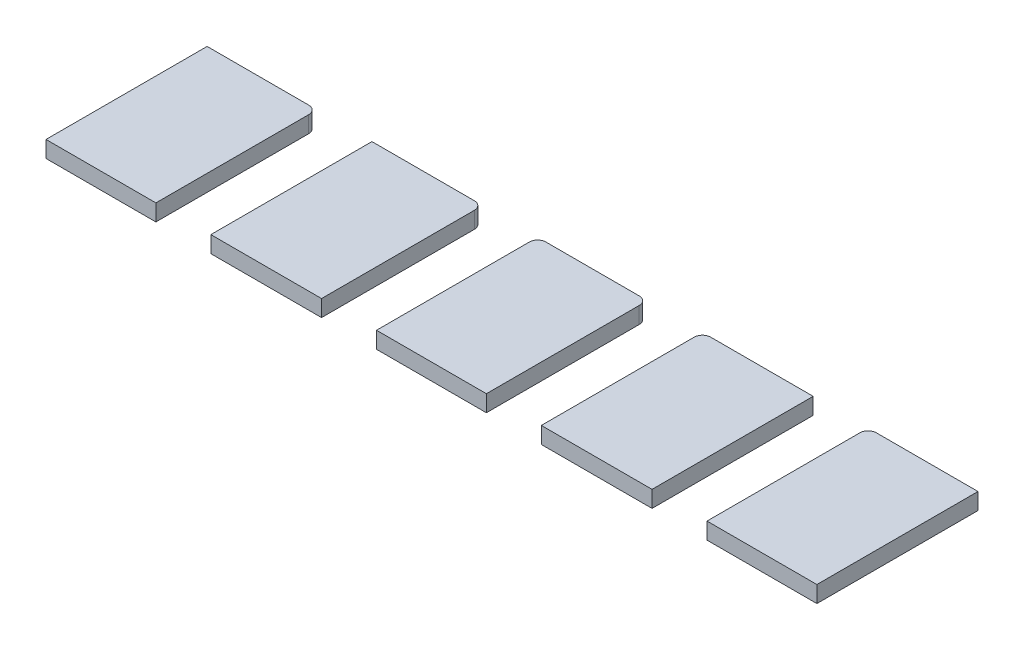
ISO-10303-21;
HEADER;
FILE_DESCRIPTION(('STEP AP214'),'2;1');
FILE_NAME('part.step','',(''),(''),'','','');
FILE_SCHEMA(('AUTOMOTIVE_DESIGN { 1 0 10303 214 1 1 1 1 }'));
ENDSEC;
DATA;
#1=APPLICATION_CONTEXT('core data for automotive mechanical design processes');
#2=APPLICATION_PROTOCOL_DEFINITION('international standard','automotive_design',2000,#1);
#3=PRODUCT_CONTEXT('',#1,'mechanical');
#4=PRODUCT('Part','Part','',(#3));
#5=PRODUCT_RELATED_PRODUCT_CATEGORY('part','',(#4));
#6=PRODUCT_DEFINITION_FORMATION('','',#4);
#7=PRODUCT_DEFINITION_CONTEXT('part definition',#1,'design');
#8=PRODUCT_DEFINITION('design','',#6,#7);
#9=PRODUCT_DEFINITION_SHAPE('','',#8);
#10=(LENGTH_UNIT() NAMED_UNIT(*) SI_UNIT(.MILLI.,.METRE.));
#11=(NAMED_UNIT(*) PLANE_ANGLE_UNIT() SI_UNIT($,.RADIAN.));
#12=(NAMED_UNIT(*) SI_UNIT($,.STERADIAN.) SOLID_ANGLE_UNIT());
#13=UNCERTAINTY_MEASURE_WITH_UNIT(LENGTH_MEASURE(1.E-05),#10,'distance_accuracy_value','');
#14=(GEOMETRIC_REPRESENTATION_CONTEXT(3) GLOBAL_UNCERTAINTY_ASSIGNED_CONTEXT((#13)) GLOBAL_UNIT_ASSIGNED_CONTEXT((#10,
#11,#12)) REPRESENTATION_CONTEXT('',''));
#15=CARTESIAN_POINT('',(0.,0.,0.));
#16=DIRECTION('',(0.,0.,1.));
#17=DIRECTION('',(1.,0.,0.));
#18=AXIS2_PLACEMENT_3D('',#15,#16,#17);
#19=CARTESIAN_POINT('',(-1.3784,12.88,7.861));
#20=DIRECTION('',(0.,-1.,0.));
#21=DIRECTION('',(0.,0.,1.));
#22=AXIS2_PLACEMENT_3D('',#19,#20,#21);
#23=PLANE('',#22);
#24=CARTESIAN_POINT('',(-2.795,12.8800000000029,8.));
#25=DIRECTION('',(0.,1.,0.));
#26=DIRECTION('',(0.,0.,1.));
#27=AXIS2_PLACEMENT_3D('',#24,#25,#26);
#28=CIRCLE('',#27,0.0999999999999994);
#29=CARTESIAN_POINT('',(-2.895,12.8800000000029,8.00000000000001));
#30=VERTEX_POINT('',#29);
#31=CARTESIAN_POINT('',(-2.79500000000009,12.8800000000014,7.9));
#32=VERTEX_POINT('',#31);
#33=EDGE_CURVE('P0_E20',#30,#32,#28,.F.);
#34=ORIENTED_EDGE('',*,*,#33,.T.);
#35=DIRECTION('',(-1.,0.,0.));
#36=VECTOR('',#35,1.);
#37=CARTESIAN_POINT('',(-1.9475,12.8800000000028,7.9));
#38=LINE('',#37,#36);
#39=CARTESIAN_POINT('',(-1.56499999999994,12.8800000000028,7.89999999999989));
#40=VERTEX_POINT('',#39);
#41=EDGE_CURVE('P0_E73',#40,#32,#38,.T.);
#42=ORIENTED_EDGE('',*,*,#41,.F.);
#43=DIRECTION('',(0.,0.,1.));
#44=VECTOR('',#43,1.);
#45=CARTESIAN_POINT('',(-1.565,12.8800000000028,9.01));
#46=LINE('',#45,#44);
#47=CARTESIAN_POINT('',(-1.565,12.8800000000028,9.85));
#48=VERTEX_POINT('',#47);
#49=EDGE_CURVE('P0_E68',#40,#48,#46,.T.);
#50=ORIENTED_EDGE('',*,*,#49,.T.);
#51=DIRECTION('',(-1.,0.,0.));
#52=VECTOR('',#51,1.);
#53=CARTESIAN_POINT('',(-6.23,12.8800000000028,9.85));
#54=LINE('',#53,#52);
#55=CARTESIAN_POINT('',(-2.895,12.8800000000028,9.85));
#56=VERTEX_POINT('',#55);
#57=EDGE_CURVE('P0_E102',#48,#56,#54,.T.);
#58=ORIENTED_EDGE('',*,*,#57,.T.);
#59=DIRECTION('',(0.,0.,1.));
#60=VECTOR('',#59,1.);
#61=CARTESIAN_POINT('',(-2.895,12.8800000000028,8.925));
#62=LINE('',#61,#60);
#63=EDGE_CURVE('P0_E57',#30,#56,#62,.T.);
#64=ORIENTED_EDGE('',*,*,#63,.F.);
#65=EDGE_LOOP('',(#34,#42,#50,#58,#64));
#66=FACE_BOUND('',#65,.T.);
#67=ADVANCED_FACE('P0_F16',(#66),#23,.T.);
#68=CARTESIAN_POINT('',(-1.565,12.84637000268,8.136370002676));
#69=DIRECTION('',(-1.,0.,0.));
#70=DIRECTION('',(0.,0.,1.));
#71=AXIS2_PLACEMENT_3D('',#68,#69,#70);
#72=PLANE('',#71);
#73=DIRECTION('',(0.,-1.,0.));
#74=VECTOR('',#73,1.);
#75=CARTESIAN_POINT('',(-1.565,12.98,9.85));
#76=LINE('',#75,#74);
#77=CARTESIAN_POINT('',(-1.565,13.08,9.85));
#78=VERTEX_POINT('',#77);
#79=EDGE_CURVE('P0_E100',#78,#48,#76,.T.);
#80=ORIENTED_EDGE('',*,*,#79,.T.);
#81=ORIENTED_EDGE('',*,*,#49,.F.);
#82=DIRECTION('',(0.,-1.,0.));
#83=VECTOR('',#82,1.);
#84=CARTESIAN_POINT('',(-1.565,12.98,7.89999999999984));
#85=LINE('',#84,#83);
#86=CARTESIAN_POINT('',(-1.565,13.08,7.89999999999995));
#87=VERTEX_POINT('',#86);
#88=EDGE_CURVE('P0_E76',#87,#40,#85,.T.);
#89=ORIENTED_EDGE('',*,*,#88,.F.);
#90=DIRECTION('',(0.,0.,1.));
#91=VECTOR('',#90,1.);
#92=CARTESIAN_POINT('',(-1.565,13.08,8.875));
#93=LINE('',#92,#91);
#94=EDGE_CURVE('P0_E82',#87,#78,#93,.T.);
#95=ORIENTED_EDGE('',*,*,#94,.T.);
#96=EDGE_LOOP('',(#80,#81,#89,#95));
#97=FACE_BOUND('',#96,.T.);
#98=ADVANCED_FACE('P0_F127',(#97),#72,.F.);
#99=CARTESIAN_POINT('',(-11.0816,13.11362999732,9.85));
#100=DIRECTION('',(0.,0.,-1.));
#101=DIRECTION('',(1.,0.,0.));
#102=AXIS2_PLACEMENT_3D('',#99,#100,#101);
#103=PLANE('',#102);
#104=DIRECTION('',(0.,1.,0.));
#105=VECTOR('',#104,1.);
#106=CARTESIAN_POINT('',(-2.895,12.98,9.85));
#107=LINE('',#106,#105);
#108=CARTESIAN_POINT('',(-2.895,13.08,9.85));
#109=VERTEX_POINT('',#108);
#110=EDGE_CURVE('P0_E84',#56,#109,#107,.T.);
#111=ORIENTED_EDGE('',*,*,#110,.F.);
#112=ORIENTED_EDGE('',*,*,#57,.F.);
#113=ORIENTED_EDGE('',*,*,#79,.F.);
#114=DIRECTION('',(-1.,0.,0.));
#115=VECTOR('',#114,1.);
#116=CARTESIAN_POINT('',(-6.23,13.08,9.85));
#117=LINE('',#116,#115);
#118=EDGE_CURVE('P0_E95',#78,#109,#117,.T.);
#119=ORIENTED_EDGE('',*,*,#118,.T.);
#120=EDGE_LOOP('',(#111,#112,#113,#119));
#121=FACE_BOUND('',#120,.T.);
#122=ADVANCED_FACE('P0_F125',(#121),#103,.F.);
#123=CARTESIAN_POINT('',(-2.895,12.84637000268,7.963));
#124=DIRECTION('',(-1.,0.,0.));
#125=DIRECTION('',(0.,0.,1.));
#126=AXIS2_PLACEMENT_3D('',#123,#124,#125);
#127=PLANE('',#126);
#128=ORIENTED_EDGE('',*,*,#110,.T.);
#129=DIRECTION('',(0.,0.,-1.));
#130=VECTOR('',#129,1.);
#131=CARTESIAN_POINT('',(-2.895,13.08,8.875));
#132=LINE('',#131,#130);
#133=CARTESIAN_POINT('',(-2.895,13.0799999999986,8.00000000000001));
#134=VERTEX_POINT('',#133);
#135=EDGE_CURVE('P0_E26',#109,#134,#132,.T.);
#136=ORIENTED_EDGE('',*,*,#135,.T.);
#137=DIRECTION('',(0.,-1.,0.));
#138=VECTOR('',#137,1.);
#139=CARTESIAN_POINT('',(-2.895,12.98,8.00000000000001));
#140=LINE('',#139,#138);
#141=EDGE_CURVE('P0_E80',#134,#30,#140,.T.);
#142=ORIENTED_EDGE('',*,*,#141,.T.);
#143=ORIENTED_EDGE('',*,*,#63,.T.);
#144=EDGE_LOOP('',(#128,#136,#142,#143));
#145=FACE_BOUND('',#144,.T.);
#146=ADVANCED_FACE('P0_F130',(#145),#127,.T.);
#147=CARTESIAN_POINT('',(-2.795,12.8800000000029,8.));
#148=DIRECTION('',(0.,1.,0.));
#149=DIRECTION('',(0.,0.,1.));
#150=AXIS2_PLACEMENT_3D('',#147,#148,#149);
#151=CYLINDRICAL_SURFACE('',#150,0.0999999999999994);
#152=ORIENTED_EDGE('',*,*,#141,.F.);
#153=CARTESIAN_POINT('',(-2.795,13.0799999999971,8.));
#154=DIRECTION('',(0.,1.,0.));
#155=DIRECTION('',(0.,0.,1.));
#156=AXIS2_PLACEMENT_3D('',#153,#154,#155);
#157=CIRCLE('',#156,0.0999999999999994);
#158=CARTESIAN_POINT('',(-2.79500000000009,13.0799999999986,7.9));
#159=VERTEX_POINT('',#158);
#160=EDGE_CURVE('P0_E11',#134,#159,#157,.F.);
#161=ORIENTED_EDGE('',*,*,#160,.T.);
#162=DIRECTION('',(0.,1.,0.));
#163=VECTOR('',#162,1.);
#164=CARTESIAN_POINT('',(-2.79500000000017,12.98,7.9));
#165=LINE('',#164,#163);
#166=EDGE_CURVE('P0_E75',#32,#159,#165,.T.);
#167=ORIENTED_EDGE('',*,*,#166,.F.);
#168=ORIENTED_EDGE('',*,*,#33,.F.);
#169=EDGE_LOOP('',(#152,#161,#167,#168));
#170=FACE_BOUND('',#169,.T.);
#171=ADVANCED_FACE('P0_F79',(#170),#151,.T.);
#172=CARTESIAN_POINT('',(-2.296370002676,12.84637000268,7.9));
#173=DIRECTION('',(0.,0.,-1.));
#174=DIRECTION('',(-1.,0.,0.));
#175=AXIS2_PLACEMENT_3D('',#172,#173,#174);
#176=PLANE('',#175);
#177=ORIENTED_EDGE('',*,*,#41,.T.);
#178=ORIENTED_EDGE('',*,*,#166,.T.);
#179=DIRECTION('',(1.,0.,0.));
#180=VECTOR('',#179,1.);
#181=CARTESIAN_POINT('',(-6.23,13.08,7.9));
#182=LINE('',#181,#180);
#183=EDGE_CURVE('P0_E34',#159,#87,#182,.T.);
#184=ORIENTED_EDGE('',*,*,#183,.T.);
#185=ORIENTED_EDGE('',*,*,#88,.T.);
#186=EDGE_LOOP('',(#177,#178,#184,#185));
#187=FACE_BOUND('',#186,.T.);
#188=ADVANCED_FACE('P0_F74',(#187),#176,.T.);
#189=CARTESIAN_POINT('',(-1.3784,13.08,7.861));
#190=DIRECTION('',(0.,-1.,0.));
#191=DIRECTION('',(0.,0.,1.));
#192=AXIS2_PLACEMENT_3D('',#189,#190,#191);
#193=PLANE('',#192);
#194=ORIENTED_EDGE('',*,*,#160,.F.);
#195=ORIENTED_EDGE('',*,*,#135,.F.);
#196=ORIENTED_EDGE('',*,*,#118,.F.);
#197=ORIENTED_EDGE('',*,*,#94,.F.);
#198=ORIENTED_EDGE('',*,*,#183,.F.);
#199=EDGE_LOOP('',(#194,#195,#196,#197,#198));
#200=FACE_BOUND('',#199,.T.);
#201=ADVANCED_FACE('P0_F18',(#200),#193,.F.);
#202=CLOSED_SHELL('',(#67,#98,#122,#146,#171,#188,#201));
#203=MANIFOLD_SOLID_BREP('P0_B1',#202);
#204=CARTESIAN_POINT('',(-1.3784,12.88,7.861));
#205=DIRECTION('',(0.,-1.,0.));
#206=DIRECTION('',(0.,0.,1.));
#207=AXIS2_PLACEMENT_3D('',#204,#205,#206);
#208=PLANE('',#207);
#209=CARTESIAN_POINT('',(-4.8,12.8800000000029,8.));
#210=DIRECTION('',(0.,1.,0.));
#211=DIRECTION('',(0.,0.,1.));
#212=AXIS2_PLACEMENT_3D('',#209,#210,#211);
#213=CIRCLE('',#212,0.0999999999999994);
#214=CARTESIAN_POINT('',(-4.9,12.8800000000029,8.00000000000001));
#215=VERTEX_POINT('',#214);
#216=CARTESIAN_POINT('',(-4.80000000000009,12.8800000000014,7.9));
#217=VERTEX_POINT('',#216);
#218=EDGE_CURVE('P1_E20',#215,#217,#213,.F.);
#219=ORIENTED_EDGE('',*,*,#218,.T.);
#220=DIRECTION('',(-1.,0.,0.));
#221=VECTOR('',#220,1.);
#222=CARTESIAN_POINT('',(-3.945,12.8800000000028,7.9));
#223=LINE('',#222,#221);
#224=CARTESIAN_POINT('',(-3.55999999999994,12.8800000000028,7.9));
#225=VERTEX_POINT('',#224);
#226=EDGE_CURVE('P1_E68',#225,#217,#223,.T.);
#227=ORIENTED_EDGE('',*,*,#226,.F.);
#228=DIRECTION('',(0.,0.,1.));
#229=VECTOR('',#228,1.);
#230=CARTESIAN_POINT('',(-3.56,12.8800000000028,8.875));
#231=LINE('',#230,#229);
#232=CARTESIAN_POINT('',(-3.56,12.8800000000028,9.85));
#233=VERTEX_POINT('',#232);
#234=EDGE_CURVE('P1_E101',#225,#233,#231,.T.);
#235=ORIENTED_EDGE('',*,*,#234,.T.);
#236=DIRECTION('',(-1.,0.,0.));
#237=VECTOR('',#236,1.);
#238=CARTESIAN_POINT('',(-6.23,12.8800000000028,9.85));
#239=LINE('',#238,#237);
#240=CARTESIAN_POINT('',(-4.9,12.8800000000028,9.85));
#241=VERTEX_POINT('',#240);
#242=EDGE_CURVE('P1_E100',#233,#241,#239,.T.);
#243=ORIENTED_EDGE('',*,*,#242,.T.);
#244=DIRECTION('',(0.,0.,1.));
#245=VECTOR('',#244,1.);
#246=CARTESIAN_POINT('',(-4.9,12.8800000000028,8.925));
#247=LINE('',#246,#245);
#248=EDGE_CURVE('P1_E57',#215,#241,#247,.T.);
#249=ORIENTED_EDGE('',*,*,#248,.F.);
#250=EDGE_LOOP('',(#219,#227,#235,#243,#249));
#251=FACE_BOUND('',#250,.T.);
#252=ADVANCED_FACE('P1_F16',(#251),#208,.T.);
#253=CARTESIAN_POINT('',(-3.56,12.84637000268,7.861));
#254=DIRECTION('',(-1.,0.,0.));
#255=DIRECTION('',(0.,0.,1.));
#256=AXIS2_PLACEMENT_3D('',#253,#254,#255);
#257=PLANE('',#256);
#258=DIRECTION('',(0.,-1.,0.));
#259=VECTOR('',#258,1.);
#260=CARTESIAN_POINT('',(-3.56,12.98,9.85));
#261=LINE('',#260,#259);
#262=CARTESIAN_POINT('',(-3.56,13.08,9.85));
#263=VERTEX_POINT('',#262);
#264=EDGE_CURVE('P1_E97',#263,#233,#261,.T.);
#265=ORIENTED_EDGE('',*,*,#264,.T.);
#266=ORIENTED_EDGE('',*,*,#234,.F.);
#267=DIRECTION('',(0.,-1.,0.));
#268=VECTOR('',#267,1.);
#269=CARTESIAN_POINT('',(-3.56,12.98,7.9));
#270=LINE('',#269,#268);
#271=CARTESIAN_POINT('',(-3.56,13.08,7.9));
#272=VERTEX_POINT('',#271);
#273=EDGE_CURVE('P1_E74',#272,#225,#270,.T.);
#274=ORIENTED_EDGE('',*,*,#273,.F.);
#275=DIRECTION('',(0.,0.,1.));
#276=VECTOR('',#275,1.);
#277=CARTESIAN_POINT('',(-3.56,13.08,8.875));
#278=LINE('',#277,#276);
#279=EDGE_CURVE('P1_E79',#272,#263,#278,.T.);
#280=ORIENTED_EDGE('',*,*,#279,.T.);
#281=EDGE_LOOP('',(#265,#266,#274,#280));
#282=FACE_BOUND('',#281,.T.);
#283=ADVANCED_FACE('P1_F127',(#282),#257,.F.);
#284=CARTESIAN_POINT('',(-11.0816,13.11362999732,9.85));
#285=DIRECTION('',(0.,0.,-1.));
#286=DIRECTION('',(1.,0.,0.));
#287=AXIS2_PLACEMENT_3D('',#284,#285,#286);
#288=PLANE('',#287);
#289=DIRECTION('',(0.,1.,0.));
#290=VECTOR('',#289,1.);
#291=CARTESIAN_POINT('',(-4.9,12.98,9.85));
#292=LINE('',#291,#290);
#293=CARTESIAN_POINT('',(-4.9,13.08,9.85));
#294=VERTEX_POINT('',#293);
#295=EDGE_CURVE('P1_E81',#241,#294,#292,.T.);
#296=ORIENTED_EDGE('',*,*,#295,.F.);
#297=ORIENTED_EDGE('',*,*,#242,.F.);
#298=ORIENTED_EDGE('',*,*,#264,.F.);
#299=DIRECTION('',(-1.,0.,0.));
#300=VECTOR('',#299,1.);
#301=CARTESIAN_POINT('',(-6.23,13.08,9.85));
#302=LINE('',#301,#300);
#303=EDGE_CURVE('P1_E92',#263,#294,#302,.T.);
#304=ORIENTED_EDGE('',*,*,#303,.T.);
#305=EDGE_LOOP('',(#296,#297,#298,#304));
#306=FACE_BOUND('',#305,.T.);
#307=ADVANCED_FACE('P1_F125',(#306),#288,.F.);
#308=CARTESIAN_POINT('',(-4.9,12.84637000268,7.963));
#309=DIRECTION('',(-1.,0.,0.));
#310=DIRECTION('',(0.,0.,1.));
#311=AXIS2_PLACEMENT_3D('',#308,#309,#310);
#312=PLANE('',#311);
#313=ORIENTED_EDGE('',*,*,#295,.T.);
#314=DIRECTION('',(0.,0.,-1.));
#315=VECTOR('',#314,1.);
#316=CARTESIAN_POINT('',(-4.9,13.08,8.875));
#317=LINE('',#316,#315);
#318=CARTESIAN_POINT('',(-4.9,13.0799999999986,8.00000000000001));
#319=VERTEX_POINT('',#318);
#320=EDGE_CURVE('P1_E26',#294,#319,#317,.T.);
#321=ORIENTED_EDGE('',*,*,#320,.T.);
#322=DIRECTION('',(0.,-1.,0.));
#323=VECTOR('',#322,1.);
#324=CARTESIAN_POINT('',(-4.9,12.98,8.00000000000001));
#325=LINE('',#324,#323);
#326=EDGE_CURVE('P1_E77',#319,#215,#325,.T.);
#327=ORIENTED_EDGE('',*,*,#326,.T.);
#328=ORIENTED_EDGE('',*,*,#248,.T.);
#329=EDGE_LOOP('',(#313,#321,#327,#328));
#330=FACE_BOUND('',#329,.T.);
#331=ADVANCED_FACE('P1_F130',(#330),#312,.T.);
#332=CARTESIAN_POINT('',(-4.8,12.8800000000029,8.));
#333=DIRECTION('',(0.,1.,0.));
#334=DIRECTION('',(0.,0.,1.));
#335=AXIS2_PLACEMENT_3D('',#332,#333,#334);
#336=CYLINDRICAL_SURFACE('',#335,0.0999999999999994);
#337=ORIENTED_EDGE('',*,*,#326,.F.);
#338=CARTESIAN_POINT('',(-4.8,13.0799999999971,8.));
#339=DIRECTION('',(0.,1.,0.));
#340=DIRECTION('',(0.,0.,1.));
#341=AXIS2_PLACEMENT_3D('',#338,#339,#340);
#342=CIRCLE('',#341,0.0999999999999994);
#343=CARTESIAN_POINT('',(-4.80000000000009,13.0799999999986,7.9));
#344=VERTEX_POINT('',#343);
#345=EDGE_CURVE('P1_E11',#319,#344,#342,.F.);
#346=ORIENTED_EDGE('',*,*,#345,.T.);
#347=DIRECTION('',(0.,1.,0.));
#348=VECTOR('',#347,1.);
#349=CARTESIAN_POINT('',(-4.80000000000018,12.98,7.9));
#350=LINE('',#349,#348);
#351=EDGE_CURVE('P1_E73',#217,#344,#350,.T.);
#352=ORIENTED_EDGE('',*,*,#351,.F.);
#353=ORIENTED_EDGE('',*,*,#218,.F.);
#354=EDGE_LOOP('',(#337,#346,#352,#353));
#355=FACE_BOUND('',#354,.T.);
#356=ADVANCED_FACE('P1_F76',(#355),#336,.T.);
#357=CARTESIAN_POINT('',(-4.296370002676,12.84637000268,7.9));
#358=DIRECTION('',(0.,0.,-1.));
#359=DIRECTION('',(-1.,0.,0.));
#360=AXIS2_PLACEMENT_3D('',#357,#358,#359);
#361=PLANE('',#360);
#362=ORIENTED_EDGE('',*,*,#226,.T.);
#363=ORIENTED_EDGE('',*,*,#351,.T.);
#364=DIRECTION('',(1.,0.,0.));
#365=VECTOR('',#364,1.);
#366=CARTESIAN_POINT('',(-6.23,13.08,7.9));
#367=LINE('',#366,#365);
#368=EDGE_CURVE('P1_E34',#344,#272,#367,.T.);
#369=ORIENTED_EDGE('',*,*,#368,.T.);
#370=ORIENTED_EDGE('',*,*,#273,.T.);
#371=EDGE_LOOP('',(#362,#363,#369,#370));
#372=FACE_BOUND('',#371,.T.);
#373=ADVANCED_FACE('P1_F72',(#372),#361,.T.);
#374=CARTESIAN_POINT('',(-1.3784,13.08,7.861));
#375=DIRECTION('',(0.,-1.,0.));
#376=DIRECTION('',(0.,0.,1.));
#377=AXIS2_PLACEMENT_3D('',#374,#375,#376);
#378=PLANE('',#377);
#379=ORIENTED_EDGE('',*,*,#345,.F.);
#380=ORIENTED_EDGE('',*,*,#320,.F.);
#381=ORIENTED_EDGE('',*,*,#303,.F.);
#382=ORIENTED_EDGE('',*,*,#279,.F.);
#383=ORIENTED_EDGE('',*,*,#368,.F.);
#384=EDGE_LOOP('',(#379,#380,#381,#382,#383));
#385=FACE_BOUND('',#384,.T.);
#386=ADVANCED_FACE('P1_F18',(#385),#378,.F.);
#387=CLOSED_SHELL('',(#252,#283,#307,#331,#356,#373,#386));
#388=MANIFOLD_SOLID_BREP('P1_B1',#387);
#389=CARTESIAN_POINT('',(-1.3784,12.88,7.861));
#390=DIRECTION('',(0.,-1.,0.));
#391=DIRECTION('',(0.,0.,1.));
#392=AXIS2_PLACEMENT_3D('',#389,#390,#391);
#393=PLANE('',#392);
#394=CARTESIAN_POINT('',(-6.795,12.8800000000029,8.));
#395=DIRECTION('',(0.,-1.,0.));
#396=DIRECTION('',(0.,0.,-1.));
#397=AXIS2_PLACEMENT_3D('',#394,#395,#396);
#398=CIRCLE('',#397,0.1);
#399=CARTESIAN_POINT('',(-6.895,12.8800000000029,8.));
#400=VERTEX_POINT('',#399);
#401=CARTESIAN_POINT('',(-6.79500000000008,12.8800000000014,7.9));
#402=VERTEX_POINT('',#401);
#403=EDGE_CURVE('P2_E20',#400,#402,#398,.T.);
#404=ORIENTED_EDGE('',*,*,#403,.T.);
#405=DIRECTION('',(-1.,0.,0.));
#406=VECTOR('',#405,1.);
#407=CARTESIAN_POINT('',(-5.7675,12.8800000000028,7.9));
#408=LINE('',#407,#406);
#409=CARTESIAN_POINT('',(-5.66500000000001,12.8800000000029,7.9));
#410=VERTEX_POINT('',#409);
#411=EDGE_CURVE('P2_E111',#410,#402,#408,.T.);
#412=ORIENTED_EDGE('',*,*,#411,.F.);
#413=CARTESIAN_POINT('',(-5.665,12.8800000000029,8.));
#414=DIRECTION('',(0.,1.,0.));
#415=DIRECTION('',(0.,0.,1.));
#416=AXIS2_PLACEMENT_3D('',#413,#414,#415);
#417=CIRCLE('',#416,0.0999999999999994);
#418=CARTESIAN_POINT('',(-5.565,12.8800000000029,8.));
#419=VERTEX_POINT('',#418);
#420=EDGE_CURVE('P2_E107',#410,#419,#417,.F.);
#421=ORIENTED_EDGE('',*,*,#420,.T.);
#422=DIRECTION('',(0.,0.,1.));
#423=VECTOR('',#422,1.);
#424=CARTESIAN_POINT('',(-5.565,12.8800000000028,8.925));
#425=LINE('',#424,#423);
#426=CARTESIAN_POINT('',(-5.565,12.8800000000028,9.85));
#427=VERTEX_POINT('',#426);
#428=EDGE_CURVE('P2_E106',#419,#427,#425,.T.);
#429=ORIENTED_EDGE('',*,*,#428,.T.);
#430=DIRECTION('',(-1.,0.,0.));
#431=VECTOR('',#430,1.);
#432=CARTESIAN_POINT('',(-6.23,12.8800000000028,9.85));
#433=LINE('',#432,#431);
#434=CARTESIAN_POINT('',(-6.895,12.8800000000028,9.85));
#435=VERTEX_POINT('',#434);
#436=EDGE_CURVE('P2_E100',#427,#435,#433,.T.);
#437=ORIENTED_EDGE('',*,*,#436,.T.);
#438=DIRECTION('',(0.,0.,1.));
#439=VECTOR('',#438,1.);
#440=CARTESIAN_POINT('',(-6.895,12.8800000000028,8.925));
#441=LINE('',#440,#439);
#442=EDGE_CURVE('P2_E67',#400,#435,#441,.T.);
#443=ORIENTED_EDGE('',*,*,#442,.F.);
#444=EDGE_LOOP('',(#404,#412,#421,#429,#437,#443));
#445=FACE_BOUND('',#444,.T.);
#446=ADVANCED_FACE('P2_F16',(#445),#393,.T.);
#447=CARTESIAN_POINT('',(-5.665,12.8800000000029,8.));
#448=DIRECTION('',(0.,1.,0.));
#449=DIRECTION('',(0.,0.,1.));
#450=AXIS2_PLACEMENT_3D('',#447,#448,#449);
#451=CYLINDRICAL_SURFACE('',#450,0.0999999999999994);
#452=DIRECTION('',(0.,-1.,0.));
#453=VECTOR('',#452,1.);
#454=CARTESIAN_POINT('',(-5.565,12.98,8.));
#455=LINE('',#454,#453);
#456=CARTESIAN_POINT('',(-5.565,13.0799999999986,8.));
#457=VERTEX_POINT('',#456);
#458=EDGE_CURVE('P2_E103',#457,#419,#455,.T.);
#459=ORIENTED_EDGE('',*,*,#458,.T.);
#460=ORIENTED_EDGE('',*,*,#420,.F.);
#461=DIRECTION('',(0.,-1.,0.));
#462=VECTOR('',#461,1.);
#463=CARTESIAN_POINT('',(-5.66500000000001,12.98,7.9));
#464=LINE('',#463,#462);
#465=CARTESIAN_POINT('',(-5.66500000000001,13.0799999999986,7.9));
#466=VERTEX_POINT('',#465);
#467=EDGE_CURVE('P2_E108',#466,#410,#464,.T.);
#468=ORIENTED_EDGE('',*,*,#467,.F.);
#469=CARTESIAN_POINT('',(-5.665,13.0799999999971,8.));
#470=DIRECTION('',(0.,1.,0.));
#471=DIRECTION('',(0.,0.,1.));
#472=AXIS2_PLACEMENT_3D('',#469,#470,#471);
#473=CIRCLE('',#472,0.0999999999999994);
#474=EDGE_CURVE('P2_E92',#466,#457,#473,.F.);
#475=ORIENTED_EDGE('',*,*,#474,.T.);
#476=EDGE_LOOP('',(#459,#460,#468,#475));
#477=FACE_BOUND('',#476,.T.);
#478=ADVANCED_FACE('P2_F133',(#477),#451,.T.);
#479=CARTESIAN_POINT('',(-5.565,12.84637000268,7.963));
#480=DIRECTION('',(-1.,0.,0.));
#481=DIRECTION('',(0.,0.,1.));
#482=AXIS2_PLACEMENT_3D('',#479,#480,#481);
#483=PLANE('',#482);
#484=DIRECTION('',(0.,-1.,0.));
#485=VECTOR('',#484,1.);
#486=CARTESIAN_POINT('',(-5.565,12.98,9.85));
#487=LINE('',#486,#485);
#488=CARTESIAN_POINT('',(-5.565,13.08,9.85));
#489=VERTEX_POINT('',#488);
#490=EDGE_CURVE('P2_E89',#489,#427,#487,.T.);
#491=ORIENTED_EDGE('',*,*,#490,.T.);
#492=ORIENTED_EDGE('',*,*,#428,.F.);
#493=ORIENTED_EDGE('',*,*,#458,.F.);
#494=DIRECTION('',(0.,0.,1.));
#495=VECTOR('',#494,1.);
#496=CARTESIAN_POINT('',(-5.565,13.08,8.875));
#497=LINE('',#496,#495);
#498=EDGE_CURVE('P2_E90',#457,#489,#497,.T.);
#499=ORIENTED_EDGE('',*,*,#498,.T.);
#500=EDGE_LOOP('',(#491,#492,#493,#499));
#501=FACE_BOUND('',#500,.T.);
#502=ADVANCED_FACE('P2_F132',(#501),#483,.F.);
#503=CARTESIAN_POINT('',(-11.0816,13.11362999732,9.85));
#504=DIRECTION('',(0.,0.,-1.));
#505=DIRECTION('',(1.,0.,0.));
#506=AXIS2_PLACEMENT_3D('',#503,#504,#505);
#507=PLANE('',#506);
#508=DIRECTION('',(-1.,0.,0.));
#509=VECTOR('',#508,1.);
#510=CARTESIAN_POINT('',(-6.23,13.08,9.85));
#511=LINE('',#510,#509);
#512=CARTESIAN_POINT('',(-6.895,13.08,9.85));
#513=VERTEX_POINT('',#512);
#514=EDGE_CURVE('P2_E84',#489,#513,#511,.T.);
#515=ORIENTED_EDGE('',*,*,#514,.T.);
#516=DIRECTION('',(0.,1.,0.));
#517=VECTOR('',#516,1.);
#518=CARTESIAN_POINT('',(-6.895,12.98,9.85));
#519=LINE('',#518,#517);
#520=EDGE_CURVE('P2_E75',#435,#513,#519,.T.);
#521=ORIENTED_EDGE('',*,*,#520,.F.);
#522=ORIENTED_EDGE('',*,*,#436,.F.);
#523=ORIENTED_EDGE('',*,*,#490,.F.);
#524=EDGE_LOOP('',(#515,#521,#522,#523));
#525=FACE_BOUND('',#524,.T.);
#526=ADVANCED_FACE('P2_F87',(#525),#507,.F.);
#527=CARTESIAN_POINT('',(-6.895,12.84637000268,7.963));
#528=DIRECTION('',(-1.,0.,0.));
#529=DIRECTION('',(0.,0.,1.));
#530=AXIS2_PLACEMENT_3D('',#527,#528,#529);
#531=PLANE('',#530);
#532=ORIENTED_EDGE('',*,*,#520,.T.);
#533=DIRECTION('',(0.,0.,-1.));
#534=VECTOR('',#533,1.);
#535=CARTESIAN_POINT('',(-6.895,13.08,8.875));
#536=LINE('',#535,#534);
#537=CARTESIAN_POINT('',(-6.895,13.0799999999986,8.));
#538=VERTEX_POINT('',#537);
#539=EDGE_CURVE('P2_E26',#513,#538,#536,.T.);
#540=ORIENTED_EDGE('',*,*,#539,.T.);
#541=DIRECTION('',(0.,-1.,0.));
#542=VECTOR('',#541,1.);
#543=CARTESIAN_POINT('',(-6.895,12.98,8.));
#544=LINE('',#543,#542);
#545=EDGE_CURVE('P2_E80',#538,#400,#544,.T.);
#546=ORIENTED_EDGE('',*,*,#545,.T.);
#547=ORIENTED_EDGE('',*,*,#442,.T.);
#548=EDGE_LOOP('',(#532,#540,#546,#547));
#549=FACE_BOUND('',#548,.T.);
#550=ADVANCED_FACE('P2_F77',(#549),#531,.T.);
#551=CARTESIAN_POINT('',(-6.795,13.0799999999971,8.));
#552=DIRECTION('',(0.,-1.,0.));
#553=DIRECTION('',(0.,0.,-1.));
#554=AXIS2_PLACEMENT_3D('',#551,#552,#553);
#555=CYLINDRICAL_SURFACE('',#554,0.1);
#556=ORIENTED_EDGE('',*,*,#545,.F.);
#557=CARTESIAN_POINT('',(-6.795,13.0799999999971,8.));
#558=DIRECTION('',(0.,-1.,0.));
#559=DIRECTION('',(0.,0.,-1.));
#560=AXIS2_PLACEMENT_3D('',#557,#558,#559);
#561=CIRCLE('',#560,0.1);
#562=CARTESIAN_POINT('',(-6.79500000000008,13.0799999999986,7.9));
#563=VERTEX_POINT('',#562);
#564=EDGE_CURVE('P2_E11',#538,#563,#561,.T.);
#565=ORIENTED_EDGE('',*,*,#564,.T.);
#566=DIRECTION('',(0.,1.,0.));
#567=VECTOR('',#566,1.);
#568=CARTESIAN_POINT('',(-6.79500000000015,12.98,7.9));
#569=LINE('',#568,#567);
#570=EDGE_CURVE('P2_E136',#402,#563,#569,.T.);
#571=ORIENTED_EDGE('',*,*,#570,.F.);
#572=ORIENTED_EDGE('',*,*,#403,.F.);
#573=EDGE_LOOP('',(#556,#565,#571,#572));
#574=FACE_BOUND('',#573,.T.);
#575=ADVANCED_FACE('P2_F144',(#574),#555,.T.);
#576=CARTESIAN_POINT('',(-5.836370002676,12.84637000268,7.9));
#577=DIRECTION('',(0.,0.,-1.));
#578=DIRECTION('',(-1.,0.,0.));
#579=AXIS2_PLACEMENT_3D('',#576,#577,#578);
#580=PLANE('',#579);
#581=ORIENTED_EDGE('',*,*,#411,.T.);
#582=ORIENTED_EDGE('',*,*,#570,.T.);
#583=DIRECTION('',(1.,0.,0.));
#584=VECTOR('',#583,1.);
#585=CARTESIAN_POINT('',(-6.23,13.08,7.9));
#586=LINE('',#585,#584);
#587=EDGE_CURVE('P2_E35',#563,#466,#586,.T.);
#588=ORIENTED_EDGE('',*,*,#587,.T.);
#589=ORIENTED_EDGE('',*,*,#467,.T.);
#590=EDGE_LOOP('',(#581,#582,#588,#589));
#591=FACE_BOUND('',#590,.T.);
#592=ADVANCED_FACE('P2_F135',(#591),#580,.T.);
#593=CARTESIAN_POINT('',(-1.3784,13.08,7.861));
#594=DIRECTION('',(0.,-1.,0.));
#595=DIRECTION('',(0.,0.,1.));
#596=AXIS2_PLACEMENT_3D('',#593,#594,#595);
#597=PLANE('',#596);
#598=ORIENTED_EDGE('',*,*,#587,.F.);
#599=ORIENTED_EDGE('',*,*,#564,.F.);
#600=ORIENTED_EDGE('',*,*,#539,.F.);
#601=ORIENTED_EDGE('',*,*,#514,.F.);
#602=ORIENTED_EDGE('',*,*,#498,.F.);
#603=ORIENTED_EDGE('',*,*,#474,.F.);
#604=EDGE_LOOP('',(#598,#599,#600,#601,#602,#603));
#605=FACE_BOUND('',#604,.T.);
#606=ADVANCED_FACE('P2_F18',(#605),#597,.F.);
#607=CLOSED_SHELL('',(#446,#478,#502,#526,#550,#575,#592,#606));
#608=MANIFOLD_SOLID_BREP('P2_B1',#607);
#609=CARTESIAN_POINT('',(-1.3784,12.88,7.861));
#610=DIRECTION('',(0.,-1.,0.));
#611=DIRECTION('',(0.,0.,1.));
#612=AXIS2_PLACEMENT_3D('',#609,#610,#611);
#613=PLANE('',#612);
#614=DIRECTION('',(0.,0.,1.));
#615=VECTOR('',#614,1.);
#616=CARTESIAN_POINT('',(-8.9,12.8800000000028,8.875));
#617=LINE('',#616,#615);
#618=CARTESIAN_POINT('',(-8.90000000000004,12.88,7.9));
#619=VERTEX_POINT('',#618);
#620=CARTESIAN_POINT('',(-8.9,12.8800000000014,9.85));
#621=VERTEX_POINT('',#620);
#622=EDGE_CURVE('P3_E104',#619,#621,#617,.T.);
#623=ORIENTED_EDGE('',*,*,#622,.F.);
#624=DIRECTION('',(-1.,0.,0.));
#625=VECTOR('',#624,1.);
#626=CARTESIAN_POINT('',(-7.895,12.8800000000028,7.9));
#627=LINE('',#626,#625);
#628=CARTESIAN_POINT('',(-7.66,12.8800000000029,7.9));
#629=VERTEX_POINT('',#628);
#630=EDGE_CURVE('P3_E62',#629,#619,#627,.T.);
#631=ORIENTED_EDGE('',*,*,#630,.F.);
#632=CARTESIAN_POINT('',(-7.66,12.8800000000029,8.));
#633=DIRECTION('',(0.,-1.,0.));
#634=DIRECTION('',(0.,0.,-1.));
#635=AXIS2_PLACEMENT_3D('',#632,#633,#634);
#636=CIRCLE('',#635,0.0999999999999994);
#637=CARTESIAN_POINT('',(-7.56,12.8800000000029,8.));
#638=VERTEX_POINT('',#637);
#639=EDGE_CURVE('P3_E20',#629,#638,#636,.T.);
#640=ORIENTED_EDGE('',*,*,#639,.T.);
#641=DIRECTION('',(0.,0.,1.));
#642=VECTOR('',#641,1.);
#643=CARTESIAN_POINT('',(-7.56,12.8800000000028,8.925));
#644=LINE('',#643,#642);
#645=CARTESIAN_POINT('',(-7.56,12.8800000000028,9.85));
#646=VERTEX_POINT('',#645);
#647=EDGE_CURVE('P3_E66',#638,#646,#644,.T.);
#648=ORIENTED_EDGE('',*,*,#647,.T.);
#649=DIRECTION('',(-1.,0.,0.));
#650=VECTOR('',#649,1.);
#651=CARTESIAN_POINT('',(-6.23,12.8800000000028,9.85));
#652=LINE('',#651,#650);
#653=EDGE_CURVE('P3_E94',#646,#621,#652,.T.);
#654=ORIENTED_EDGE('',*,*,#653,.T.);
#655=EDGE_LOOP('',(#623,#631,#640,#648,#654));
#656=FACE_BOUND('',#655,.T.);
#657=ADVANCED_FACE('P3_F16',(#656),#613,.T.);
#658=CARTESIAN_POINT('',(-7.66,13.0799999999971,8.));
#659=DIRECTION('',(0.,-1.,0.));
#660=DIRECTION('',(0.,0.,-1.));
#661=AXIS2_PLACEMENT_3D('',#658,#659,#660);
#662=CYLINDRICAL_SURFACE('',#661,0.0999999999999994);
#663=DIRECTION('',(0.,-1.,0.));
#664=VECTOR('',#663,1.);
#665=CARTESIAN_POINT('',(-7.56,12.98,8.));
#666=LINE('',#665,#664);
#667=CARTESIAN_POINT('',(-7.56,13.0799999999986,8.));
#668=VERTEX_POINT('',#667);
#669=EDGE_CURVE('P3_E71',#668,#638,#666,.T.);
#670=ORIENTED_EDGE('',*,*,#669,.T.);
#671=ORIENTED_EDGE('',*,*,#639,.F.);
#672=DIRECTION('',(0.,-1.,0.));
#673=VECTOR('',#672,1.);
#674=CARTESIAN_POINT('',(-7.66,12.98,7.9));
#675=LINE('',#674,#673);
#676=CARTESIAN_POINT('',(-7.66,13.0799999999986,7.9));
#677=VERTEX_POINT('',#676);
#678=EDGE_CURVE('P3_E72',#677,#629,#675,.T.);
#679=ORIENTED_EDGE('',*,*,#678,.F.);
#680=CARTESIAN_POINT('',(-7.66,13.0799999999971,8.));
#681=DIRECTION('',(0.,-1.,0.));
#682=DIRECTION('',(0.,0.,-1.));
#683=AXIS2_PLACEMENT_3D('',#680,#681,#682);
#684=CIRCLE('',#683,0.0999999999999994);
#685=EDGE_CURVE('P3_E82',#677,#668,#684,.T.);
#686=ORIENTED_EDGE('',*,*,#685,.T.);
#687=EDGE_LOOP('',(#670,#671,#679,#686));
#688=FACE_BOUND('',#687,.T.);
#689=ADVANCED_FACE('P3_F81',(#688),#662,.T.);
#690=CARTESIAN_POINT('',(-7.56,12.84637000268,7.963));
#691=DIRECTION('',(-1.,0.,0.));
#692=DIRECTION('',(0.,0.,1.));
#693=AXIS2_PLACEMENT_3D('',#690,#691,#692);
#694=PLANE('',#693);
#695=DIRECTION('',(0.,-1.,0.));
#696=VECTOR('',#695,1.);
#697=CARTESIAN_POINT('',(-7.56,12.98,9.85));
#698=LINE('',#697,#696);
#699=CARTESIAN_POINT('',(-7.56,13.08,9.85));
#700=VERTEX_POINT('',#699);
#701=EDGE_CURVE('P3_E78',#700,#646,#698,.T.);
#702=ORIENTED_EDGE('',*,*,#701,.T.);
#703=ORIENTED_EDGE('',*,*,#647,.F.);
#704=ORIENTED_EDGE('',*,*,#669,.F.);
#705=DIRECTION('',(0.,0.,1.));
#706=VECTOR('',#705,1.);
#707=CARTESIAN_POINT('',(-7.56,13.08,8.875));
#708=LINE('',#707,#706);
#709=EDGE_CURVE('P3_E90',#668,#700,#708,.T.);
#710=ORIENTED_EDGE('',*,*,#709,.T.);
#711=EDGE_LOOP('',(#702,#703,#704,#710));
#712=FACE_BOUND('',#711,.T.);
#713=ADVANCED_FACE('P3_F75',(#712),#694,.F.);
#714=CARTESIAN_POINT('',(-11.0816,13.11362999732,9.85));
#715=DIRECTION('',(0.,0.,-1.));
#716=DIRECTION('',(1.,0.,0.));
#717=AXIS2_PLACEMENT_3D('',#714,#715,#716);
#718=PLANE('',#717);
#719=ORIENTED_EDGE('',*,*,#701,.F.);
#720=DIRECTION('',(-1.,0.,0.));
#721=VECTOR('',#720,1.);
#722=CARTESIAN_POINT('',(-6.23,13.08,9.85));
#723=LINE('',#722,#721);
#724=CARTESIAN_POINT('',(-8.9,13.0799999999979,9.85));
#725=VERTEX_POINT('',#724);
#726=EDGE_CURVE('P3_E26',#700,#725,#723,.T.);
#727=ORIENTED_EDGE('',*,*,#726,.T.);
#728=DIRECTION('',(0.,1.,0.));
#729=VECTOR('',#728,1.);
#730=CARTESIAN_POINT('',(-8.9,12.98,9.85));
#731=LINE('',#730,#729);
#732=EDGE_CURVE('P3_E86',#621,#725,#731,.T.);
#733=ORIENTED_EDGE('',*,*,#732,.F.);
#734=ORIENTED_EDGE('',*,*,#653,.F.);
#735=EDGE_LOOP('',(#719,#727,#733,#734));
#736=FACE_BOUND('',#735,.T.);
#737=ADVANCED_FACE('P3_F126',(#736),#718,.F.);
#738=CARTESIAN_POINT('',(-8.9,12.84637000268,7.861));
#739=DIRECTION('',(-1.,0.,0.));
#740=DIRECTION('',(0.,0.,1.));
#741=AXIS2_PLACEMENT_3D('',#738,#739,#740);
#742=PLANE('',#741);
#743=ORIENTED_EDGE('',*,*,#732,.T.);
#744=DIRECTION('',(0.,0.,-1.));
#745=VECTOR('',#744,1.);
#746=CARTESIAN_POINT('',(-8.9,13.08,8.875));
#747=LINE('',#746,#745);
#748=CARTESIAN_POINT('',(-8.90000000000005,13.0799999999979,7.9));
#749=VERTEX_POINT('',#748);
#750=EDGE_CURVE('P3_E11',#725,#749,#747,.T.);
#751=ORIENTED_EDGE('',*,*,#750,.T.);
#752=DIRECTION('',(0.,1.,0.));
#753=VECTOR('',#752,1.);
#754=CARTESIAN_POINT('',(-8.90000000000019,12.98,7.9));
#755=LINE('',#754,#753);
#756=EDGE_CURVE('P3_E110',#619,#749,#755,.T.);
#757=ORIENTED_EDGE('',*,*,#756,.F.);
#758=ORIENTED_EDGE('',*,*,#622,.T.);
#759=EDGE_LOOP('',(#743,#751,#757,#758));
#760=FACE_BOUND('',#759,.T.);
#761=ADVANCED_FACE('P3_F122',(#760),#742,.T.);
#762=CARTESIAN_POINT('',(-8.096370002676,12.84637000268,7.9));
#763=DIRECTION('',(0.,0.,-1.));
#764=DIRECTION('',(-1.,0.,0.));
#765=AXIS2_PLACEMENT_3D('',#762,#763,#764);
#766=PLANE('',#765);
#767=ORIENTED_EDGE('',*,*,#630,.T.);
#768=ORIENTED_EDGE('',*,*,#756,.T.);
#769=DIRECTION('',(1.,0.,0.));
#770=VECTOR('',#769,1.);
#771=CARTESIAN_POINT('',(-6.23,13.08,7.9));
#772=LINE('',#771,#770);
#773=EDGE_CURVE('P3_E35',#749,#677,#772,.T.);
#774=ORIENTED_EDGE('',*,*,#773,.T.);
#775=ORIENTED_EDGE('',*,*,#678,.T.);
#776=EDGE_LOOP('',(#767,#768,#774,#775));
#777=FACE_BOUND('',#776,.T.);
#778=ADVANCED_FACE('P3_F119',(#777),#766,.T.);
#779=CARTESIAN_POINT('',(-1.3784,13.08,7.861));
#780=DIRECTION('',(0.,-1.,0.));
#781=DIRECTION('',(0.,0.,1.));
#782=AXIS2_PLACEMENT_3D('',#779,#780,#781);
#783=PLANE('',#782);
#784=ORIENTED_EDGE('',*,*,#750,.F.);
#785=ORIENTED_EDGE('',*,*,#726,.F.);
#786=ORIENTED_EDGE('',*,*,#709,.F.);
#787=ORIENTED_EDGE('',*,*,#685,.F.);
#788=ORIENTED_EDGE('',*,*,#773,.F.);
#789=EDGE_LOOP('',(#784,#785,#786,#787,#788));
#790=FACE_BOUND('',#789,.T.);
#791=ADVANCED_FACE('P3_F18',(#790),#783,.F.);
#792=CLOSED_SHELL('',(#657,#689,#713,#737,#761,#778,#791));
#793=MANIFOLD_SOLID_BREP('P3_B1',#792);
#794=CARTESIAN_POINT('',(-1.3784,12.88,7.861));
#795=DIRECTION('',(0.,-1.,0.));
#796=DIRECTION('',(0.,0.,1.));
#797=AXIS2_PLACEMENT_3D('',#794,#795,#796);
#798=PLANE('',#797);
#799=DIRECTION('',(0.,0.,-1.));
#800=VECTOR('',#799,1.);
#801=CARTESIAN_POINT('',(-10.895,12.88,8.875));
#802=LINE('',#801,#800);
#803=CARTESIAN_POINT('',(-10.895,12.8800000000003,9.85));
#804=VERTEX_POINT('',#803);
#805=CARTESIAN_POINT('',(-10.8949999999988,12.88,7.9));
#806=VERTEX_POINT('',#805);
#807=EDGE_CURVE('P4_E98',#804,#806,#802,.T.);
#808=ORIENTED_EDGE('',*,*,#807,.T.);
#809=DIRECTION('',(-1.,0.,0.));
#810=VECTOR('',#809,1.);
#811=CARTESIAN_POINT('',(-9.897499999998,12.8800000000028,7.9));
#812=LINE('',#811,#810);
#813=CARTESIAN_POINT('',(-9.665,12.8800000000029,7.9));
#814=VERTEX_POINT('',#813);
#815=EDGE_CURVE('P4_E61',#814,#806,#812,.T.);
#816=ORIENTED_EDGE('',*,*,#815,.F.);
#817=CARTESIAN_POINT('',(-9.665,12.8800000000029,8.));
#818=DIRECTION('',(0.,-1.,0.));
#819=DIRECTION('',(0.,0.,-1.));
#820=AXIS2_PLACEMENT_3D('',#817,#818,#819);
#821=CIRCLE('',#820,0.0999999999999994);
#822=CARTESIAN_POINT('',(-9.565,12.8800000000029,8.));
#823=VERTEX_POINT('',#822);
#824=EDGE_CURVE('P4_E20',#814,#823,#821,.T.);
#825=ORIENTED_EDGE('',*,*,#824,.T.);
#826=DIRECTION('',(0.,0.,1.));
#827=VECTOR('',#826,1.);
#828=CARTESIAN_POINT('',(-9.565,12.8800000000028,8.925));
#829=LINE('',#828,#827);
#830=CARTESIAN_POINT('',(-9.565,12.8800000000019,9.85));
#831=VERTEX_POINT('',#830);
#832=EDGE_CURVE('P4_E66',#823,#831,#829,.T.);
#833=ORIENTED_EDGE('',*,*,#832,.T.);
#834=DIRECTION('',(-1.,0.,0.));
#835=VECTOR('',#834,1.);
#836=CARTESIAN_POINT('',(-6.23,12.88,9.85));
#837=LINE('',#836,#835);
#838=EDGE_CURVE('P4_E103',#831,#804,#837,.T.);
#839=ORIENTED_EDGE('',*,*,#838,.T.);
#840=EDGE_LOOP('',(#808,#816,#825,#833,#839));
#841=FACE_BOUND('',#840,.T.);
#842=ADVANCED_FACE('P4_F16',(#841),#798,.T.);
#843=CARTESIAN_POINT('',(-9.665,13.0799999999971,8.));
#844=DIRECTION('',(0.,-1.,0.));
#845=DIRECTION('',(0.,0.,-1.));
#846=AXIS2_PLACEMENT_3D('',#843,#844,#845);
#847=CYLINDRICAL_SURFACE('',#846,0.0999999999999994);
#848=DIRECTION('',(0.,-1.,0.));
#849=VECTOR('',#848,1.);
#850=CARTESIAN_POINT('',(-9.565,12.98,8.));
#851=LINE('',#850,#849);
#852=CARTESIAN_POINT('',(-9.565,13.0799999999986,8.));
#853=VERTEX_POINT('',#852);
#854=EDGE_CURVE('P4_E71',#853,#823,#851,.T.);
#855=ORIENTED_EDGE('',*,*,#854,.T.);
#856=ORIENTED_EDGE('',*,*,#824,.F.);
#857=DIRECTION('',(0.,-1.,0.));
#858=VECTOR('',#857,1.);
#859=CARTESIAN_POINT('',(-9.665,12.98,7.9));
#860=LINE('',#859,#858);
#861=CARTESIAN_POINT('',(-9.665,13.0799999999986,7.9));
#862=VERTEX_POINT('',#861);
#863=EDGE_CURVE('P4_E72',#862,#814,#860,.T.);
#864=ORIENTED_EDGE('',*,*,#863,.F.);
#865=CARTESIAN_POINT('',(-9.665,13.0799999999971,8.));
#866=DIRECTION('',(0.,-1.,0.));
#867=DIRECTION('',(0.,0.,-1.));
#868=AXIS2_PLACEMENT_3D('',#865,#866,#867);
#869=CIRCLE('',#868,0.0999999999999994);
#870=EDGE_CURVE('P4_E81',#862,#853,#869,.T.);
#871=ORIENTED_EDGE('',*,*,#870,.T.);
#872=EDGE_LOOP('',(#855,#856,#864,#871));
#873=FACE_BOUND('',#872,.T.);
#874=ADVANCED_FACE('P4_F80',(#873),#847,.T.);
#875=CARTESIAN_POINT('',(-9.565,12.84637000268,7.963));
#876=DIRECTION('',(-1.,0.,0.));
#877=DIRECTION('',(0.,0.,1.));
#878=AXIS2_PLACEMENT_3D('',#875,#876,#877);
#879=PLANE('',#878);
#880=DIRECTION('',(0.,-1.,0.));
#881=VECTOR('',#880,1.);
#882=CARTESIAN_POINT('',(-9.565,12.98,9.85));
#883=LINE('',#882,#881);
#884=CARTESIAN_POINT('',(-9.565,13.08,9.85));
#885=VERTEX_POINT('',#884);
#886=EDGE_CURVE('P4_E77',#885,#831,#883,.T.);
#887=ORIENTED_EDGE('',*,*,#886,.T.);
#888=ORIENTED_EDGE('',*,*,#832,.F.);
#889=ORIENTED_EDGE('',*,*,#854,.F.);
#890=DIRECTION('',(0.,0.,1.));
#891=VECTOR('',#890,1.);
#892=CARTESIAN_POINT('',(-9.565,13.08,8.875));
#893=LINE('',#892,#891);
#894=EDGE_CURVE('P4_E89',#853,#885,#893,.T.);
#895=ORIENTED_EDGE('',*,*,#894,.T.);
#896=EDGE_LOOP('',(#887,#888,#889,#895));
#897=FACE_BOUND('',#896,.T.);
#898=ADVANCED_FACE('P4_F74',(#897),#879,.F.);
#899=CARTESIAN_POINT('',(-11.0816,13.11362999732,9.85));
#900=DIRECTION('',(0.,0.,-1.));
#901=DIRECTION('',(1.,0.,0.));
#902=AXIS2_PLACEMENT_3D('',#899,#900,#901);
#903=PLANE('',#902);
#904=ORIENTED_EDGE('',*,*,#886,.F.);
#905=DIRECTION('',(-1.,0.,0.));
#906=VECTOR('',#905,1.);
#907=CARTESIAN_POINT('',(-6.23,13.08,9.85));
#908=LINE('',#907,#906);
#909=CARTESIAN_POINT('',(-10.895,13.0799999999979,9.85));
#910=VERTEX_POINT('',#909);
#911=EDGE_CURVE('P4_E26',#885,#910,#908,.T.);
#912=ORIENTED_EDGE('',*,*,#911,.T.);
#913=DIRECTION('',(0.,1.,0.));
#914=VECTOR('',#913,1.);
#915=CARTESIAN_POINT('',(-10.895,12.98,9.85));
#916=LINE('',#915,#914);
#917=EDGE_CURVE('P4_E93',#804,#910,#916,.T.);
#918=ORIENTED_EDGE('',*,*,#917,.F.);
#919=ORIENTED_EDGE('',*,*,#838,.F.);
#920=EDGE_LOOP('',(#904,#912,#918,#919));
#921=FACE_BOUND('',#920,.T.);
#922=ADVANCED_FACE('P4_F128',(#921),#903,.F.);
#923=CARTESIAN_POINT('',(-10.895,12.84637000268,7.866370002676));
#924=DIRECTION('',(-1.,0.,0.));
#925=DIRECTION('',(0.,0.,1.));
#926=AXIS2_PLACEMENT_3D('',#923,#924,#925);
#927=PLANE('',#926);
#928=ORIENTED_EDGE('',*,*,#807,.F.);
#929=ORIENTED_EDGE('',*,*,#917,.T.);
#930=DIRECTION('',(0.,0.,-1.));
#931=VECTOR('',#930,1.);
#932=CARTESIAN_POINT('',(-10.895,13.08,8.875));
#933=LINE('',#932,#931);
#934=CARTESIAN_POINT('',(-10.8949999999991,13.0799999999979,7.89999999999992));
#935=VERTEX_POINT('',#934);
#936=EDGE_CURVE('P4_E11',#910,#935,#933,.T.);
#937=ORIENTED_EDGE('',*,*,#936,.T.);
#938=DIRECTION('',(0.,1.,0.));
#939=VECTOR('',#938,1.);
#940=CARTESIAN_POINT('',(-10.8949999999965,12.98,7.9));
#941=LINE('',#940,#939);
#942=EDGE_CURVE('P4_E107',#806,#935,#941,.T.);
#943=ORIENTED_EDGE('',*,*,#942,.F.);
#944=EDGE_LOOP('',(#928,#929,#937,#943));
#945=FACE_BOUND('',#944,.T.);
#946=ADVANCED_FACE('P4_F124',(#945),#927,.T.);
#947=CARTESIAN_POINT('',(-10.09637000268,12.84637000268,7.9));
#948=DIRECTION('',(0.,0.,-1.));
#949=DIRECTION('',(-1.,0.,0.));
#950=AXIS2_PLACEMENT_3D('',#947,#948,#949);
#951=PLANE('',#950);
#952=ORIENTED_EDGE('',*,*,#815,.T.);
#953=ORIENTED_EDGE('',*,*,#942,.T.);
#954=DIRECTION('',(1.,0.,0.));
#955=VECTOR('',#954,1.);
#956=CARTESIAN_POINT('',(-6.23,13.08,7.9));
#957=LINE('',#956,#955);
#958=EDGE_CURVE('P4_E35',#935,#862,#957,.T.);
#959=ORIENTED_EDGE('',*,*,#958,.T.);
#960=ORIENTED_EDGE('',*,*,#863,.T.);
#961=EDGE_LOOP('',(#952,#953,#959,#960));
#962=FACE_BOUND('',#961,.T.);
#963=ADVANCED_FACE('P4_F121',(#962),#951,.T.);
#964=CARTESIAN_POINT('',(-1.3784,13.08,7.861));
#965=DIRECTION('',(0.,-1.,0.));
#966=DIRECTION('',(0.,0.,1.));
#967=AXIS2_PLACEMENT_3D('',#964,#965,#966);
#968=PLANE('',#967);
#969=ORIENTED_EDGE('',*,*,#958,.F.);
#970=ORIENTED_EDGE('',*,*,#936,.F.);
#971=ORIENTED_EDGE('',*,*,#911,.F.);
#972=ORIENTED_EDGE('',*,*,#894,.F.);
#973=ORIENTED_EDGE('',*,*,#870,.F.);
#974=EDGE_LOOP('',(#969,#970,#971,#972,#973));
#975=FACE_BOUND('',#974,.T.);
#976=ADVANCED_FACE('P4_F18',(#975),#968,.F.);
#977=CLOSED_SHELL('',(#842,#874,#898,#922,#946,#963,#976));
#978=MANIFOLD_SOLID_BREP('P4_B1',#977);
#979=ADVANCED_BREP_SHAPE_REPRESENTATION('',(#18,#203,#388,#608,#793,#978),#14);
#980=SHAPE_DEFINITION_REPRESENTATION(#9,#979);
ENDSEC;
END-ISO-10303-21;
